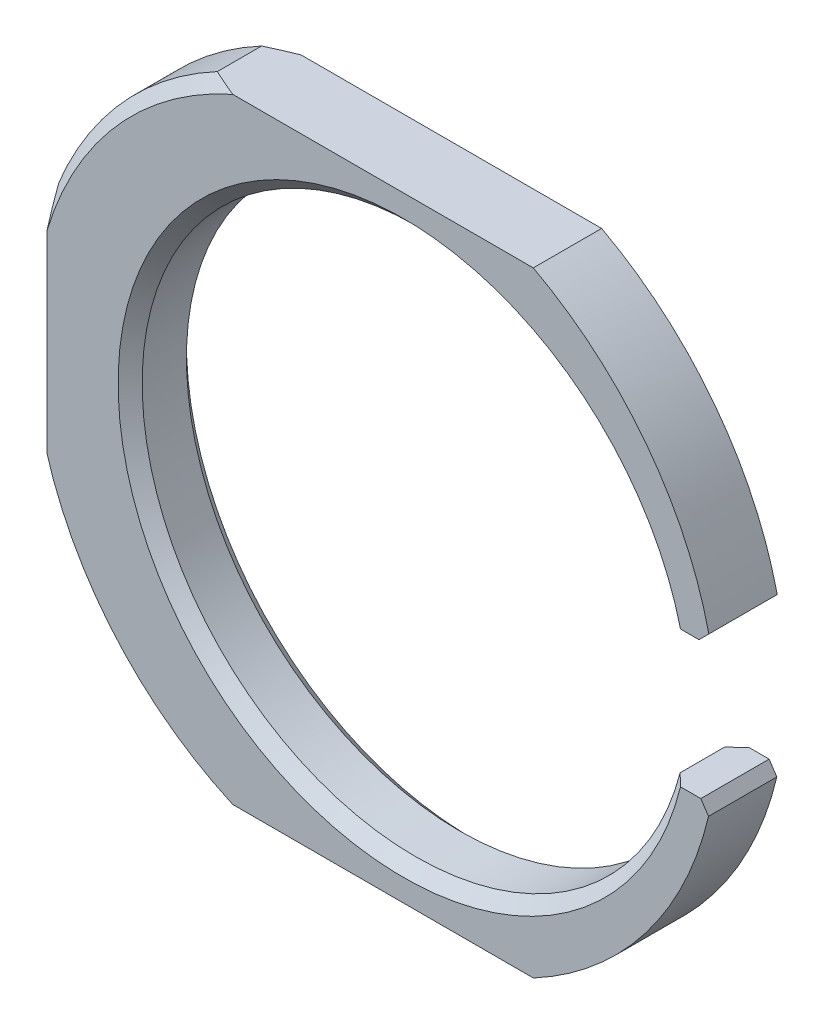
ISO-10303-21;
HEADER;
FILE_DESCRIPTION(('STEP AP214'),'2;1');
FILE_NAME('part.step','',(''),(''),'','','');
FILE_SCHEMA(('AUTOMOTIVE_DESIGN { 1 0 10303 214 1 1 1 1 }'));
ENDSEC;
DATA;
#1=APPLICATION_CONTEXT('core data for automotive mechanical design processes');
#2=APPLICATION_PROTOCOL_DEFINITION('international standard','automotive_design',2000,#1);
#3=PRODUCT_CONTEXT('',#1,'mechanical');
#4=PRODUCT('Part','Part','',(#3));
#5=PRODUCT_RELATED_PRODUCT_CATEGORY('part','',(#4));
#6=PRODUCT_DEFINITION_FORMATION('','',#4);
#7=PRODUCT_DEFINITION_CONTEXT('part definition',#1,'design');
#8=PRODUCT_DEFINITION('design','',#6,#7);
#9=PRODUCT_DEFINITION_SHAPE('','',#8);
#10=(LENGTH_UNIT() NAMED_UNIT(*) SI_UNIT(.MILLI.,.METRE.));
#11=(NAMED_UNIT(*) PLANE_ANGLE_UNIT() SI_UNIT($,.RADIAN.));
#12=(NAMED_UNIT(*) SI_UNIT($,.STERADIAN.) SOLID_ANGLE_UNIT());
#13=UNCERTAINTY_MEASURE_WITH_UNIT(LENGTH_MEASURE(1.E-05),#10,'distance_accuracy_value','');
#14=(GEOMETRIC_REPRESENTATION_CONTEXT(3) GLOBAL_UNCERTAINTY_ASSIGNED_CONTEXT((#13)) GLOBAL_UNIT_ASSIGNED_CONTEXT((#10,
#11,#12)) REPRESENTATION_CONTEXT('',''));
#15=CARTESIAN_POINT('',(0.,0.,0.));
#16=DIRECTION('',(0.,0.,1.));
#17=DIRECTION('',(1.,0.,0.));
#18=AXIS2_PLACEMENT_3D('',#15,#16,#17);
#19=CARTESIAN_POINT('',(7.62,14.2875,3.175));
#20=DIRECTION('',(0.,-1.,0.));
#21=DIRECTION('',(0.,0.,-1.));
#22=AXIS2_PLACEMENT_3D('',#19,#20,#21);
#23=PLANE('',#22);
#24=DIRECTION('',(-1.,0.,0.));
#25=VECTOR('',#24,1.);
#26=CARTESIAN_POINT('',(7.62,14.2875,0.));
#27=LINE('',#26,#25);
#28=CARTESIAN_POINT('',(7.62,14.2875,0.));
#29=VERTEX_POINT('',#28);
#30=CARTESIAN_POINT('',(-6.34664631439312,14.2875,0.));
#31=VERTEX_POINT('',#30);
#32=EDGE_CURVE('E190',#29,#31,#27,.T.);
#33=ORIENTED_EDGE('',*,*,#32,.T.);
#34=CARTESIAN_POINT('',(-6.34664631439313,14.2875,0.));
#35=CARTESIAN_POINT('',(-6.45404104298012,14.2875,0.0435982299034301));
#36=CARTESIAN_POINT('',(-6.56111289626262,14.2875,0.087988948330012));
#37=CARTESIAN_POINT('',(-6.77459834155767,14.2875,0.178272735871204));
#38=CARTESIAN_POINT('',(-6.88101205076103,14.2875,0.224165527796904));
#39=CARTESIAN_POINT('',(-7.09320699370116,14.2875,0.31738640247918));
#40=CARTESIAN_POINT('',(-7.19898823406698,14.2875,0.364714470160571));
#41=CARTESIAN_POINT('',(-7.40994842174969,14.2875,0.460745408772582));
#42=CARTESIAN_POINT('',(-7.51512725495978,14.2875,0.509448530437032));
#43=CARTESIAN_POINT('',(-7.62000000000002,14.2875,0.558799999999944));
#44=B_SPLINE_CURVE_WITH_KNOTS('',3,(#34,#35,#36,#37,#38,#39,#40,#41,#42,#43),.UNSPECIFIED.,.F.,
.F.,(4,2,2,2,4),(0.,0.347716312491453,0.695368816103363,1.04301766946793,1.39073032947845),.UNSPECIFIED.);
#45=CARTESIAN_POINT('',(-7.62,14.2875,0.558800000000005));
#46=VERTEX_POINT('',#45);
#47=EDGE_CURVE('E308',#31,#46,#44,.T.);
#48=ORIENTED_EDGE('',*,*,#47,.T.);
#49=DIRECTION('',(0.,0.,-1.));
#50=VECTOR('',#49,1.);
#51=CARTESIAN_POINT('',(-7.62,14.2875,3.175));
#52=LINE('',#51,#50);
#53=CARTESIAN_POINT('',(-7.62,14.2875,2.61619999999999));
#54=VERTEX_POINT('',#53);
#55=EDGE_CURVE('E222',#54,#46,#52,.T.);
#56=ORIENTED_EDGE('',*,*,#55,.F.);
#57=CARTESIAN_POINT('',(-7.62,14.2875,2.61619999999999));
#58=CARTESIAN_POINT('',(-7.51512725495977,14.2875,2.66555146956294));
#59=CARTESIAN_POINT('',(-7.40994842174969,14.2875,2.71425459122741));
#60=CARTESIAN_POINT('',(-7.19898823406699,14.2875,2.81028552983943));
#61=CARTESIAN_POINT('',(-7.09320699370117,14.2875,2.85761359752082));
#62=CARTESIAN_POINT('',(-6.88101205076104,14.2875,2.95083447220309));
#63=CARTESIAN_POINT('',(-6.77459834155767,14.2875,2.9967272641288));
#64=CARTESIAN_POINT('',(-6.56111289626263,14.2875,3.08701105166999));
#65=CARTESIAN_POINT('',(-6.45404104298013,14.2875,3.13140177009657));
#66=CARTESIAN_POINT('',(-6.34664631439313,14.2875,3.175));
#67=B_SPLINE_CURVE_WITH_KNOTS('',3,(#57,#58,#59,#60,#61,#62,#63,#64,#65,#66),.UNSPECIFIED.,.F.,
.F.,(4,2,2,2,4),(0.,0.347712660010522,0.695361513375088,1.043014016987,1.39073032947845),.UNSPECIFIED.);
#68=CARTESIAN_POINT('',(-6.34664631439313,14.2875,3.175));
#69=VERTEX_POINT('',#68);
#70=EDGE_CURVE('E302',#54,#69,#67,.T.);
#71=ORIENTED_EDGE('',*,*,#70,.T.);
#72=DIRECTION('',(-1.,0.,0.));
#73=VECTOR('',#72,1.);
#74=CARTESIAN_POINT('',(7.62,14.2875,3.175));
#75=LINE('',#74,#73);
#76=CARTESIAN_POINT('',(7.62,14.2875,3.175));
#77=VERTEX_POINT('',#76);
#78=EDGE_CURVE('E207',#77,#69,#75,.T.);
#79=ORIENTED_EDGE('',*,*,#78,.F.);
#80=DIRECTION('',(0.,0.,-1.));
#81=VECTOR('',#80,1.);
#82=CARTESIAN_POINT('',(7.62,14.2875,3.175));
#83=LINE('',#82,#81);
#84=EDGE_CURVE('E189',#77,#29,#83,.T.);
#85=ORIENTED_EDGE('',*,*,#84,.T.);
#86=EDGE_LOOP('',(#33,#48,#56,#71,#79,#85));
#87=FACE_BOUND('',#86,.T.);
#88=ADVANCED_FACE('F33',(#87),#23,.F.);
#89=CARTESIAN_POINT('',(0.,0.,3.175));
#90=DIRECTION('',(0.,0.,-1.));
#91=DIRECTION('',(-1.,0.,0.));
#92=AXIS2_PLACEMENT_3D('',#89,#90,#91);
#93=CYLINDRICAL_SURFACE('',#92,16.1925);
#94=ORIENTED_EDGE('',*,*,#55,.T.);
#95=CARTESIAN_POINT('',(0.,0.,0.558800000000005));
#96=DIRECTION('',(0.,0.,1.));
#97=DIRECTION('',(1.,0.,0.));
#98=AXIS2_PLACEMENT_3D('',#95,#96,#97);
#99=CIRCLE('',#98,16.1925);
#100=CARTESIAN_POINT('',(-14.986,6.13325853441709,0.558800000000005));
#101=VERTEX_POINT('',#100);
#102=EDGE_CURVE('E410',#46,#101,#99,.T.);
#103=ORIENTED_EDGE('',*,*,#102,.T.);
#104=DIRECTION('',(0.,0.,-1.));
#105=VECTOR('',#104,1.);
#106=CARTESIAN_POINT('',(-14.986,6.13325853441709,3.175));
#107=LINE('',#106,#105);
#108=CARTESIAN_POINT('',(-14.986,6.13325853441709,2.61619999999999));
#109=VERTEX_POINT('',#108);
#110=EDGE_CURVE('E219',#109,#101,#107,.T.);
#111=ORIENTED_EDGE('',*,*,#110,.F.);
#112=CARTESIAN_POINT('',(0.,0.,2.61619999999999));
#113=DIRECTION('',(0.,0.,1.));
#114=DIRECTION('',(1.,0.,0.));
#115=AXIS2_PLACEMENT_3D('',#112,#113,#114);
#116=CIRCLE('',#115,16.1925);
#117=EDGE_CURVE('E413',#109,#54,#116,.F.);
#118=ORIENTED_EDGE('',*,*,#117,.T.);
#119=EDGE_LOOP('',(#94,#103,#111,#118));
#120=FACE_BOUND('',#119,.T.);
#121=ADVANCED_FACE('F260',(#120),#93,.T.);
#122=CARTESIAN_POINT('',(-14.986,6.13325853441708,3.175));
#123=DIRECTION('',(1.,0.,0.));
#124=DIRECTION('',(0.,0.,-1.));
#125=AXIS2_PLACEMENT_3D('',#122,#123,#124);
#126=PLANE('',#125);
#127=DIRECTION('',(0.,-1.,0.));
#128=VECTOR('',#127,1.);
#129=CARTESIAN_POINT('',(-14.986,6.13325853441708,0.));
#130=LINE('',#129,#128);
#131=CARTESIAN_POINT('',(-14.986,4.45335600306105,0.));
#132=VERTEX_POINT('',#131);
#133=CARTESIAN_POINT('',(-14.986,-4.45335600306103,0.));
#134=VERTEX_POINT('',#133);
#135=EDGE_CURVE('E193',#132,#134,#130,.T.);
#136=ORIENTED_EDGE('',*,*,#135,.T.);
#137=CARTESIAN_POINT('',(-14.986,-4.45335600306103,0.));
#138=CARTESIAN_POINT('',(-14.986,-4.59532339639313,0.0404398765741876));
#139=CARTESIAN_POINT('',(-14.986,-4.73681905004097,0.0825230687504273));
#140=CARTESIAN_POINT('',(-14.986,-5.01878121089509,0.16979330733088));
#141=CARTESIAN_POINT('',(-14.986,-5.15924814970773,0.214978958425647));
#142=CARTESIAN_POINT('',(-14.986,-5.4391904429487,0.308306542242773));
#143=CARTESIAN_POINT('',(-14.986,-5.57866582336938,0.356448397151095));
#144=CARTESIAN_POINT('',(-14.986,-5.85668176785979,0.455552446877674));
#145=CARTESIAN_POINT('',(-14.986,-5.99522188616804,0.506515892847684));
#146=CARTESIAN_POINT('',(-14.986,-6.13325853441708,0.558800000000006));
#147=B_SPLINE_CURVE_WITH_KNOTS('',3,(#137,#138,#139,#140,#141,#142,#143,#144,#145,#146),
.UNSPECIFIED.,.F.,.F.,(4,2,2,2,4),(0.,0.442829437828835,0.885461004480531,1.32808092504822,
1.77089870930894),.UNSPECIFIED.);
#148=CARTESIAN_POINT('',(-14.986,-6.13325853441708,0.558800000000005));
#149=VERTEX_POINT('',#148);
#150=EDGE_CURVE('E284',#134,#149,#147,.T.);
#151=ORIENTED_EDGE('',*,*,#150,.T.);
#152=DIRECTION('',(0.,0.,-1.));
#153=VECTOR('',#152,1.);
#154=CARTESIAN_POINT('',(-14.986,-6.13325853441708,3.175));
#155=LINE('',#154,#153);
#156=CARTESIAN_POINT('',(-14.986,-6.13325853441708,2.61619999999998));
#157=VERTEX_POINT('',#156);
#158=EDGE_CURVE('E216',#157,#149,#155,.T.);
#159=ORIENTED_EDGE('',*,*,#158,.F.);
#160=CARTESIAN_POINT('',(-14.986,-6.13325853441708,2.61619999999998));
#161=CARTESIAN_POINT('',(-14.986,-5.99522188616804,2.6684841071523));
#162=CARTESIAN_POINT('',(-14.986,-5.85668176785979,2.71944755312232));
#163=CARTESIAN_POINT('',(-14.986,-5.57866582336937,2.8185516028489));
#164=CARTESIAN_POINT('',(-14.986,-5.43919044294869,2.86669345775722));
#165=CARTESIAN_POINT('',(-14.986,-5.15924814970771,2.96002104157435));
#166=CARTESIAN_POINT('',(-14.986,-5.01878121089507,3.00520669266911));
#167=CARTESIAN_POINT('',(-14.986,-4.73681905004096,3.09247693124957));
#168=CARTESIAN_POINT('',(-14.986,-4.59532339639311,3.13456012342581));
#169=CARTESIAN_POINT('',(-14.986,-4.45335600306101,3.175));
#170=B_SPLINE_CURVE_WITH_KNOTS('',3,(#160,#161,#162,#163,#164,#165,#166,#167,#168,#169),
.UNSPECIFIED.,.F.,.F.,(4,2,2,2,4),(0.,0.442817784260725,0.885437704828423,1.32806927148013,
1.77089870930897),.UNSPECIFIED.);
#171=CARTESIAN_POINT('',(-14.986,-4.453356003061,3.175));
#172=VERTEX_POINT('',#171);
#173=EDGE_CURVE('E280',#157,#172,#170,.T.);
#174=ORIENTED_EDGE('',*,*,#173,.T.);
#175=DIRECTION('',(0.,-1.,0.));
#176=VECTOR('',#175,1.);
#177=CARTESIAN_POINT('',(-14.986,6.13325853441708,3.175));
#178=LINE('',#177,#176);
#179=CARTESIAN_POINT('',(-14.986,4.45335600306105,3.175));
#180=VERTEX_POINT('',#179);
#181=EDGE_CURVE('E167',#180,#172,#178,.T.);
#182=ORIENTED_EDGE('',*,*,#181,.F.);
#183=CARTESIAN_POINT('',(-14.986,4.45335600306105,3.175));
#184=CARTESIAN_POINT('',(-14.986,4.59532339639316,3.13456012342581));
#185=CARTESIAN_POINT('',(-14.986,4.73681905004099,3.09247693124957));
#186=CARTESIAN_POINT('',(-14.986,5.0187812108951,3.00520669266912));
#187=CARTESIAN_POINT('',(-14.986,5.15924814970774,2.96002104157435));
#188=CARTESIAN_POINT('',(-14.986,5.43919044294871,2.86669345775722));
#189=CARTESIAN_POINT('',(-14.986,5.57866582336939,2.8185516028489));
#190=CARTESIAN_POINT('',(-14.986,5.8566817678598,2.71944755312232));
#191=CARTESIAN_POINT('',(-14.986,5.99522188616805,2.66848410715231));
#192=CARTESIAN_POINT('',(-14.986,6.13325853441709,2.61619999999999));
#193=B_SPLINE_CURVE_WITH_KNOTS('',3,(#183,#184,#185,#186,#187,#188,#189,#190,#191,#192),
.UNSPECIFIED.,.F.,.F.,(4,2,2,2,4),(0.,0.442829437828829,0.88546100448052,1.32808092504821,
1.77089870930892),.UNSPECIFIED.);
#194=EDGE_CURVE('E266',#180,#109,#193,.T.);
#195=ORIENTED_EDGE('',*,*,#194,.T.);
#196=ORIENTED_EDGE('',*,*,#110,.T.);
#197=CARTESIAN_POINT('',(-14.986,6.13325853441709,0.558800000000005));
#198=CARTESIAN_POINT('',(-14.986,5.99522188616805,0.506515892847682));
#199=CARTESIAN_POINT('',(-14.986,5.8566817678598,0.455552446877673));
#200=CARTESIAN_POINT('',(-14.986,5.57866582336939,0.356448397151096));
#201=CARTESIAN_POINT('',(-14.986,5.4391904429487,0.308306542242776));
#202=CARTESIAN_POINT('',(-14.986,5.15924814970773,0.21497895842565));
#203=CARTESIAN_POINT('',(-14.986,5.0187812108951,0.169793307330881));
#204=CARTESIAN_POINT('',(-14.986,4.73681905004099,0.0825230687504263));
#205=CARTESIAN_POINT('',(-14.986,4.59532339639315,0.0404398765741859));
#206=CARTESIAN_POINT('',(-14.986,4.45335600306104,0.));
#207=B_SPLINE_CURVE_WITH_KNOTS('',3,(#197,#198,#199,#200,#201,#202,#203,#204,#205,#206),
.UNSPECIFIED.,.F.,.F.,(4,2,2,2,4),(0.,0.442817784260716,0.885437704828405,1.3280692714801,
1.77089870930893),.UNSPECIFIED.);
#208=EDGE_CURVE('E275',#101,#132,#207,.T.);
#209=ORIENTED_EDGE('',*,*,#208,.T.);
#210=EDGE_LOOP('',(#136,#151,#159,#174,#182,#195,#196,#209));
#211=FACE_BOUND('',#210,.T.);
#212=ADVANCED_FACE('F255',(#211),#126,.F.);
#213=CARTESIAN_POINT('',(0.,0.,3.175));
#214=DIRECTION('',(0.,0.,-1.));
#215=DIRECTION('',(-1.,0.,0.));
#216=AXIS2_PLACEMENT_3D('',#213,#214,#215);
#217=CYLINDRICAL_SURFACE('',#216,16.1925);
#218=ORIENTED_EDGE('',*,*,#158,.T.);
#219=CARTESIAN_POINT('',(0.,0.,0.558800000000005));
#220=DIRECTION('',(0.,0.,1.));
#221=DIRECTION('',(1.,0.,0.));
#222=AXIS2_PLACEMENT_3D('',#219,#220,#221);
#223=CIRCLE('',#222,16.1925);
#224=CARTESIAN_POINT('',(-7.62,-14.2875,0.558800000000005));
#225=VERTEX_POINT('',#224);
#226=EDGE_CURVE('E227',#149,#225,#223,.T.);
#227=ORIENTED_EDGE('',*,*,#226,.T.);
#228=DIRECTION('',(0.,0.,-1.));
#229=VECTOR('',#228,1.);
#230=CARTESIAN_POINT('',(-7.62,-14.2875,3.175));
#231=LINE('',#230,#229);
#232=CARTESIAN_POINT('',(-7.62,-14.2875,2.61619999999998));
#233=VERTEX_POINT('',#232);
#234=EDGE_CURVE('E176',#233,#225,#231,.T.);
#235=ORIENTED_EDGE('',*,*,#234,.F.);
#236=CARTESIAN_POINT('',(0.,0.,2.61619999999998));
#237=DIRECTION('',(0.,0.,1.));
#238=DIRECTION('',(1.,0.,0.));
#239=AXIS2_PLACEMENT_3D('',#236,#237,#238);
#240=CIRCLE('',#239,16.1925);
#241=EDGE_CURVE('E225',#233,#157,#240,.F.);
#242=ORIENTED_EDGE('',*,*,#241,.T.);
#243=EDGE_LOOP('',(#218,#227,#235,#242));
#244=FACE_BOUND('',#243,.T.);
#245=ADVANCED_FACE('F250',(#244),#217,.T.);
#246=CARTESIAN_POINT('',(-7.61999999999999,-14.2875,3.175));
#247=DIRECTION('',(0.,1.,0.));
#248=DIRECTION('',(0.,0.,1.));
#249=AXIS2_PLACEMENT_3D('',#246,#247,#248);
#250=PLANE('',#249);
#251=ORIENTED_EDGE('',*,*,#234,.T.);
#252=CARTESIAN_POINT('',(-7.62,-14.2875,0.558800000000005));
#253=CARTESIAN_POINT('',(-7.51512725495977,-14.2875,0.509448530437058));
#254=CARTESIAN_POINT('',(-7.40994842174969,-14.2875,0.460745408772591));
#255=CARTESIAN_POINT('',(-7.19898823406699,-14.2875,0.364714470160568));
#256=CARTESIAN_POINT('',(-7.09320699370116,-14.2875,0.317386402479179));
#257=CARTESIAN_POINT('',(-6.88101205076103,-14.2875,0.224165527796905));
#258=CARTESIAN_POINT('',(-6.77459834155766,-14.2875,0.178272735871204));
#259=CARTESIAN_POINT('',(-6.56111289626261,-14.2875,0.0879889483300097));
#260=CARTESIAN_POINT('',(-6.4540410429801,-14.2875,0.0435982299034266));
#261=CARTESIAN_POINT('',(-6.34664631439311,-14.2875,0.));
#262=B_SPLINE_CURVE_WITH_KNOTS('',3,(#252,#253,#254,#255,#256,#257,#258,#259,#260,#261),
.UNSPECIFIED.,.F.,.F.,(4,2,2,2,4),(0.,0.347712660010527,0.6953615133751,1.04301401698702,
1.39073032947848),.UNSPECIFIED.);
#263=CARTESIAN_POINT('',(-6.34664631439311,-14.2875,0.));
#264=VERTEX_POINT('',#263);
#265=EDGE_CURVE('E237',#225,#264,#262,.T.);
#266=ORIENTED_EDGE('',*,*,#265,.T.);
#267=DIRECTION('',(1.,0.,0.));
#268=VECTOR('',#267,1.);
#269=CARTESIAN_POINT('',(-7.61999999999999,-14.2875,0.));
#270=LINE('',#269,#268);
#271=CARTESIAN_POINT('',(7.61999999999999,-14.2875,0.));
#272=VERTEX_POINT('',#271);
#273=EDGE_CURVE('E174',#264,#272,#270,.T.);
#274=ORIENTED_EDGE('',*,*,#273,.T.);
#275=DIRECTION('',(0.,0.,-1.));
#276=VECTOR('',#275,1.);
#277=CARTESIAN_POINT('',(7.61999999999999,-14.2875,3.175));
#278=LINE('',#277,#276);
#279=CARTESIAN_POINT('',(7.61999999999999,-14.2875,3.175));
#280=VERTEX_POINT('',#279);
#281=EDGE_CURVE('E170',#280,#272,#278,.T.);
#282=ORIENTED_EDGE('',*,*,#281,.F.);
#283=DIRECTION('',(1.,0.,0.));
#284=VECTOR('',#283,1.);
#285=CARTESIAN_POINT('',(-7.61999999999999,-14.2875,3.175));
#286=LINE('',#285,#284);
#287=CARTESIAN_POINT('',(-6.34664631439309,-14.2875,3.175));
#288=VERTEX_POINT('',#287);
#289=EDGE_CURVE('E158',#288,#280,#286,.T.);
#290=ORIENTED_EDGE('',*,*,#289,.F.);
#291=CARTESIAN_POINT('',(-6.34664631439309,-14.2875,3.175));
#292=CARTESIAN_POINT('',(-6.45404104298009,-14.2875,3.13140177009657));
#293=CARTESIAN_POINT('',(-6.56111289626259,-14.2875,3.08701105166998));
#294=CARTESIAN_POINT('',(-6.77459834155764,-14.2875,2.99672726412879));
#295=CARTESIAN_POINT('',(-6.88101205076102,-14.2875,2.95083447220309));
#296=CARTESIAN_POINT('',(-7.09320699370114,-14.2875,2.85761359752081));
#297=CARTESIAN_POINT('',(-7.19898823406697,-14.2875,2.81028552983942));
#298=CARTESIAN_POINT('',(-7.40994842174968,-14.2875,2.7142545912274));
#299=CARTESIAN_POINT('',(-7.51512725495978,-14.2875,2.66555146956295));
#300=CARTESIAN_POINT('',(-7.62000000000003,-14.2875,2.61620000000004));
#301=B_SPLINE_CURVE_WITH_KNOTS('',3,(#291,#292,#293,#294,#295,#296,#297,#298,#299,#300),
.UNSPECIFIED.,.F.,.F.,(4,2,2,2,4),(0.,0.347716312491463,0.695368816103383,1.04301766946796,
1.39073032947849),.UNSPECIFIED.);
#302=EDGE_CURVE('E230',#288,#233,#301,.T.);
#303=ORIENTED_EDGE('',*,*,#302,.T.);
#304=EDGE_LOOP('',(#251,#266,#274,#282,#290,#303));
#305=FACE_BOUND('',#304,.T.);
#306=ADVANCED_FACE('F172',(#305),#250,.F.);
#307=CARTESIAN_POINT('',(0.,0.,3.175));
#308=DIRECTION('',(0.,0.,-1.));
#309=DIRECTION('',(-1.,0.,0.));
#310=AXIS2_PLACEMENT_3D('',#307,#308,#309);
#311=CYLINDRICAL_SURFACE('',#310,16.1925);
#312=CARTESIAN_POINT('',(0.,0.,0.));
#313=DIRECTION('',(0.,0.,1.));
#314=DIRECTION('',(1.,0.,0.));
#315=AXIS2_PLACEMENT_3D('',#312,#313,#314);
#316=CIRCLE('',#315,16.1925);
#317=CARTESIAN_POINT('',(15.7612900417545,-3.7119795890724,0.));
#318=VERTEX_POINT('',#317);
#319=EDGE_CURVE('E197',#272,#318,#316,.T.);
#320=ORIENTED_EDGE('',*,*,#319,.T.);
#321=DIRECTION('',(0.,0.,-1.));
#322=VECTOR('',#321,1.);
#323=CARTESIAN_POINT('',(15.7612900417545,-3.7119795890724,3.175));
#324=LINE('',#323,#322);
#325=CARTESIAN_POINT('',(15.7612900417545,-3.7119795890724,3.175));
#326=VERTEX_POINT('',#325);
#327=EDGE_CURVE('E11',#318,#326,#324,.F.);
#328=ORIENTED_EDGE('',*,*,#327,.T.);
#329=CARTESIAN_POINT('',(0.,0.,3.175));
#330=DIRECTION('',(0.,0.,1.));
#331=DIRECTION('',(1.,0.,0.));
#332=AXIS2_PLACEMENT_3D('',#329,#330,#331);
#333=CIRCLE('',#332,16.1925);
#334=EDGE_CURVE('E162',#280,#326,#333,.T.);
#335=ORIENTED_EDGE('',*,*,#334,.F.);
#336=ORIENTED_EDGE('',*,*,#281,.T.);
#337=EDGE_LOOP('',(#320,#328,#335,#336));
#338=FACE_BOUND('',#337,.T.);
#339=ADVANCED_FACE('F179',(#338),#311,.T.);
#340=CARTESIAN_POINT('',(13.8842221242085,-3.175,3.175));
#341=DIRECTION('',(0.,1.,0.));
#342=DIRECTION('',(-1.,0.,0.));
#343=AXIS2_PLACEMENT_3D('',#340,#341,#342);
#344=PLANE('',#343);
#345=DIRECTION('',(1.,0.,0.));
#346=VECTOR('',#345,1.);
#347=CARTESIAN_POINT('',(13.8842221242085,-3.175,3.175));
#348=LINE('',#347,#346);
#349=CARTESIAN_POINT('',(14.4605397513563,-3.175,3.175));
#350=VERTEX_POINT('',#349);
#351=CARTESIAN_POINT('',(15.403273824793,-3.175,3.175));
#352=VERTEX_POINT('',#351);
#353=EDGE_CURVE('E180',#350,#352,#348,.T.);
#354=ORIENTED_EDGE('',*,*,#353,.T.);
#355=DIRECTION('',(0.,0.,-1.));
#356=VECTOR('',#355,1.);
#357=CARTESIAN_POINT('',(15.403273824793,-3.175,0.));
#358=LINE('',#357,#356);
#359=CARTESIAN_POINT('',(15.403273824793,-3.175,0.));
#360=VERTEX_POINT('',#359);
#361=EDGE_CURVE('E41',#352,#360,#358,.T.);
#362=ORIENTED_EDGE('',*,*,#361,.T.);
#363=DIRECTION('',(1.,0.,0.));
#364=VECTOR('',#363,1.);
#365=CARTESIAN_POINT('',(13.8842221242085,-3.175,0.));
#366=LINE('',#365,#364);
#367=CARTESIAN_POINT('',(14.4605397513563,-3.175,0.));
#368=VERTEX_POINT('',#367);
#369=EDGE_CURVE('E199',#368,#360,#366,.T.);
#370=ORIENTED_EDGE('',*,*,#369,.F.);
#371=CARTESIAN_POINT('',(14.4605397513563,-3.175,0.));
#372=CARTESIAN_POINT('',(14.3645506170969,-3.175,0.0931991366032787));
#373=CARTESIAN_POINT('',(14.2685295811596,-3.175,0.186365371454051));
#374=CARTESIAN_POINT('',(14.076423705444,-3.175,0.37263203812105));
#375=CARTESIAN_POINT('',(13.9803388656654,-3.175,0.465732469936945));
#376=CARTESIAN_POINT('',(13.8842221242085,-3.175,0.558800000000001));
#377=B_SPLINE_CURVE_WITH_KNOTS('',3,(#371,#372,#373,#374,#375,#376),.UNSPECIFIED.,.F.,.F.,(4,2,
4),(0.,0.401372495231906,0.802744992491367),.UNSPECIFIED.);
#378=CARTESIAN_POINT('',(13.8842221242085,-3.175,0.558800000000002));
#379=VERTEX_POINT('',#378);
#380=EDGE_CURVE('E337',#368,#379,#377,.T.);
#381=ORIENTED_EDGE('',*,*,#380,.T.);
#382=DIRECTION('',(0.,0.,-1.));
#383=VECTOR('',#382,1.);
#384=CARTESIAN_POINT('',(13.8842221242085,-3.175,3.175));
#385=LINE('',#384,#383);
#386=CARTESIAN_POINT('',(13.8842221242085,-3.175,2.61619999999999));
#387=VERTEX_POINT('',#386);
#388=EDGE_CURVE('E177',#387,#379,#385,.T.);
#389=ORIENTED_EDGE('',*,*,#388,.F.);
#390=CARTESIAN_POINT('',(13.8842221242085,-3.175,2.61619999999999));
#391=CARTESIAN_POINT('',(13.9803388656654,-3.175,2.70926753006305));
#392=CARTESIAN_POINT('',(14.076423705444,-3.175,2.80236796187894));
#393=CARTESIAN_POINT('',(14.2685295811596,-3.175,2.98863462854595));
#394=CARTESIAN_POINT('',(14.3645506170969,-3.175,3.08180086339672));
#395=CARTESIAN_POINT('',(14.4605397513563,-3.175,3.175));
#396=B_SPLINE_CURVE_WITH_KNOTS('',3,(#390,#391,#392,#393,#394,#395),.UNSPECIFIED.,.F.,.F.,(4,2,
4),(0.,0.401372497259468,0.802744992491381),.UNSPECIFIED.);
#397=EDGE_CURVE('E313',#387,#350,#396,.T.);
#398=ORIENTED_EDGE('',*,*,#397,.T.);
#399=EDGE_LOOP('',(#354,#362,#370,#381,#389,#398));
#400=FACE_BOUND('',#399,.T.);
#401=ADVANCED_FACE('F368',(#400),#344,.T.);
#402=CARTESIAN_POINT('',(1.5875,0.,3.175));
#403=DIRECTION('',(0.,0.,-1.));
#404=DIRECTION('',(-1.,0.,0.));
#405=AXIS2_PLACEMENT_3D('',#402,#403,#404);
#406=CYLINDRICAL_SURFACE('',#405,12.7);
#407=ORIENTED_EDGE('',*,*,#388,.T.);
#408=CARTESIAN_POINT('',(1.5875,0.,0.558800000000002));
#409=DIRECTION('',(0.,0.,1.));
#410=DIRECTION('',(1.,0.,0.));
#411=AXIS2_PLACEMENT_3D('',#408,#409,#410);
#412=CIRCLE('',#411,12.7);
#413=CARTESIAN_POINT('',(13.8842221242085,3.175,0.558800000000002));
#414=VERTEX_POINT('',#413);
#415=EDGE_CURVE('E429',#379,#414,#412,.F.);
#416=ORIENTED_EDGE('',*,*,#415,.T.);
#417=DIRECTION('',(0.,0.,-1.));
#418=VECTOR('',#417,1.);
#419=CARTESIAN_POINT('',(13.8842221242085,3.175,3.175));
#420=LINE('',#419,#418);
#421=CARTESIAN_POINT('',(13.8842221242085,3.175,2.61619999999999));
#422=VERTEX_POINT('',#421);
#423=EDGE_CURVE('E210',#422,#414,#420,.T.);
#424=ORIENTED_EDGE('',*,*,#423,.F.);
#425=CARTESIAN_POINT('',(1.5875,0.,2.61619999999999));
#426=DIRECTION('',(0.,0.,1.));
#427=DIRECTION('',(1.,0.,0.));
#428=AXIS2_PLACEMENT_3D('',#425,#426,#427);
#429=CIRCLE('',#428,12.7);
#430=EDGE_CURVE('E428',#422,#387,#429,.T.);
#431=ORIENTED_EDGE('',*,*,#430,.T.);
#432=EDGE_LOOP('',(#407,#416,#424,#431));
#433=FACE_BOUND('',#432,.T.);
#434=ADVANCED_FACE('F363',(#433),#406,.F.);
#435=CARTESIAN_POINT('',(13.8842221242085,3.175,3.175));
#436=DIRECTION('',(0.,1.,0.));
#437=DIRECTION('',(-1.,0.,0.));
#438=AXIS2_PLACEMENT_3D('',#435,#436,#437);
#439=PLANE('',#438);
#440=DIRECTION('',(1.,0.,0.));
#441=VECTOR('',#440,1.);
#442=CARTESIAN_POINT('',(13.8842221242085,3.175,0.));
#443=LINE('',#442,#441);
#444=CARTESIAN_POINT('',(14.4605397513563,3.175,0.));
#445=VERTEX_POINT('',#444);
#446=CARTESIAN_POINT('',(15.3193746825635,3.175,0.));
#447=VERTEX_POINT('',#446);
#448=EDGE_CURVE('E202',#445,#447,#443,.T.);
#449=ORIENTED_EDGE('',*,*,#448,.T.);
#450=DIRECTION('',(0.,0.,1.));
#451=VECTOR('',#450,1.);
#452=CARTESIAN_POINT('',(15.3193746825635,3.175,3.175));
#453=LINE('',#452,#451);
#454=CARTESIAN_POINT('',(15.3193746825635,3.175,3.175));
#455=VERTEX_POINT('',#454);
#456=EDGE_CURVE('E388',#447,#455,#453,.T.);
#457=ORIENTED_EDGE('',*,*,#456,.T.);
#458=DIRECTION('',(1.,0.,0.));
#459=VECTOR('',#458,1.);
#460=CARTESIAN_POINT('',(13.8842221242085,3.175,3.175));
#461=LINE('',#460,#459);
#462=CARTESIAN_POINT('',(14.4605397513563,3.175,3.175));
#463=VERTEX_POINT('',#462);
#464=EDGE_CURVE('E182',#463,#455,#461,.T.);
#465=ORIENTED_EDGE('',*,*,#464,.F.);
#466=CARTESIAN_POINT('',(14.4605397513563,3.175,3.175));
#467=CARTESIAN_POINT('',(14.3645506170969,3.175,3.08180086339672));
#468=CARTESIAN_POINT('',(14.2685295811596,3.175,2.98863462854595));
#469=CARTESIAN_POINT('',(14.076423705444,3.175,2.80236796187894));
#470=CARTESIAN_POINT('',(13.9803388656654,3.175,2.70926753006305));
#471=CARTESIAN_POINT('',(13.8842221242085,3.175,2.61619999999999));
#472=B_SPLINE_CURVE_WITH_KNOTS('',3,(#466,#467,#468,#469,#470,#471),.UNSPECIFIED.,.F.,.F.,(4,2,
4),(0.,0.401372495231914,0.802744992491381),.UNSPECIFIED.);
#473=EDGE_CURVE('E351',#463,#422,#472,.T.);
#474=ORIENTED_EDGE('',*,*,#473,.T.);
#475=ORIENTED_EDGE('',*,*,#423,.T.);
#476=CARTESIAN_POINT('',(13.8842221242085,3.175,0.558800000000002));
#477=CARTESIAN_POINT('',(13.9803388656654,3.175,0.465732469936946));
#478=CARTESIAN_POINT('',(14.076423705444,3.175,0.372632038121051));
#479=CARTESIAN_POINT('',(14.2685295811596,3.175,0.186365371454051));
#480=CARTESIAN_POINT('',(14.3645506170969,3.175,0.0931991366032783));
#481=CARTESIAN_POINT('',(14.4605397513563,3.175,0.));
#482=B_SPLINE_CURVE_WITH_KNOTS('',3,(#476,#477,#478,#479,#480,#481),.UNSPECIFIED.,.F.,.F.,(4,2,
4),(0.,0.401372497259459,0.802744992491367),.UNSPECIFIED.);
#483=EDGE_CURVE('E343',#414,#445,#482,.T.);
#484=ORIENTED_EDGE('',*,*,#483,.T.);
#485=EDGE_LOOP('',(#449,#457,#465,#474,#475,#484));
#486=FACE_BOUND('',#485,.T.);
#487=ADVANCED_FACE('F357',(#486),#439,.F.);
#488=CARTESIAN_POINT('',(0.,0.,3.175));
#489=DIRECTION('',(0.,0.,-1.));
#490=DIRECTION('',(-1.,0.,0.));
#491=AXIS2_PLACEMENT_3D('',#488,#489,#490);
#492=CYLINDRICAL_SURFACE('',#491,16.1925);
#493=CARTESIAN_POINT('',(0.,0.,3.175));
#494=DIRECTION('',(0.,0.,1.));
#495=DIRECTION('',(1.,0.,0.));
#496=AXIS2_PLACEMENT_3D('',#493,#494,#495);
#497=CIRCLE('',#496,16.1925);
#498=CARTESIAN_POINT('',(15.779250183222,3.63487550065854,3.175));
#499=VERTEX_POINT('',#498);
#500=EDGE_CURVE('E187',#499,#77,#497,.T.);
#501=ORIENTED_EDGE('',*,*,#500,.F.);
#502=DIRECTION('',(0.,0.,-1.));
#503=VECTOR('',#502,1.);
#504=CARTESIAN_POINT('',(15.779250183222,3.63487550065854,3.175));
#505=LINE('',#504,#503);
#506=CARTESIAN_POINT('',(15.779250183222,3.63487550065854,0.));
#507=VERTEX_POINT('',#506);
#508=EDGE_CURVE('E350',#499,#507,#505,.T.);
#509=ORIENTED_EDGE('',*,*,#508,.T.);
#510=CARTESIAN_POINT('',(0.,0.,0.));
#511=DIRECTION('',(0.,0.,1.));
#512=DIRECTION('',(1.,0.,0.));
#513=AXIS2_PLACEMENT_3D('',#510,#511,#512);
#514=CIRCLE('',#513,16.1925);
#515=EDGE_CURVE('E205',#507,#29,#514,.T.);
#516=ORIENTED_EDGE('',*,*,#515,.T.);
#517=ORIENTED_EDGE('',*,*,#84,.F.);
#518=EDGE_LOOP('',(#501,#509,#516,#517));
#519=FACE_BOUND('',#518,.T.);
#520=ADVANCED_FACE('F362',(#519),#492,.T.);
#521=CARTESIAN_POINT('',(0.,0.,3.175));
#522=DIRECTION('',(0.,0.,1.));
#523=DIRECTION('',(1.,0.,0.));
#524=AXIS2_PLACEMENT_3D('',#521,#522,#523);
#525=PLANE('',#524);
#526=ORIENTED_EDGE('',*,*,#464,.T.);
#527=DIRECTION('',(-0.70710678118655,-0.707106781186545,0.));
#528=VECTOR('',#527,1.);
#529=CARTESIAN_POINT('',(6.07218734128168,-6.07218734128173,3.175));
#530=LINE('',#529,#528);
#531=EDGE_CURVE('E384',#455,#499,#530,.F.);
#532=ORIENTED_EDGE('',*,*,#531,.T.);
#533=ORIENTED_EDGE('',*,*,#500,.T.);
#534=ORIENTED_EDGE('',*,*,#78,.T.);
#535=CARTESIAN_POINT('',(0.,0.,3.175));
#536=DIRECTION('',(0.,0.,1.));
#537=DIRECTION('',(1.,0.,0.));
#538=AXIS2_PLACEMENT_3D('',#535,#536,#537);
#539=CIRCLE('',#538,15.6337);
#540=EDGE_CURVE('E416',#69,#180,#539,.T.);
#541=ORIENTED_EDGE('',*,*,#540,.T.);
#542=ORIENTED_EDGE('',*,*,#181,.T.);
#543=CARTESIAN_POINT('',(0.,0.,3.175));
#544=DIRECTION('',(0.,0.,1.));
#545=DIRECTION('',(1.,0.,0.));
#546=AXIS2_PLACEMENT_3D('',#543,#544,#545);
#547=CIRCLE('',#546,15.6337);
#548=EDGE_CURVE('E165',#172,#288,#547,.T.);
#549=ORIENTED_EDGE('',*,*,#548,.T.);
#550=ORIENTED_EDGE('',*,*,#289,.T.);
#551=ORIENTED_EDGE('',*,*,#334,.T.);
#552=DIRECTION('',(0.554732188398203,-0.832028965334105,0.));
#553=VECTOR('',#552,1.);
#554=CARTESIAN_POINT('',(9.19782668009242,6.13239530754339,3.175));
#555=LINE('',#554,#553);
#556=EDGE_CURVE('E48',#326,#352,#555,.F.);
#557=ORIENTED_EDGE('',*,*,#556,.T.);
#558=ORIENTED_EDGE('',*,*,#353,.F.);
#559=CARTESIAN_POINT('',(1.5875,0.,3.175));
#560=DIRECTION('',(0.,0.,1.));
#561=DIRECTION('',(1.,0.,0.));
#562=AXIS2_PLACEMENT_3D('',#559,#560,#561);
#563=CIRCLE('',#562,13.2588);
#564=EDGE_CURVE('E289',#350,#463,#563,.F.);
#565=ORIENTED_EDGE('',*,*,#564,.T.);
#566=EDGE_LOOP('',(#526,#532,#533,#534,#541,#542,#549,#550,#551,#557,#558,#565));
#567=FACE_BOUND('',#566,.T.);
#568=ADVANCED_FACE('F161',(#567),#525,.T.);
#569=CARTESIAN_POINT('',(0.,0.,0.));
#570=DIRECTION('',(0.,0.,1.));
#571=DIRECTION('',(1.,0.,0.));
#572=AXIS2_PLACEMENT_3D('',#569,#570,#571);
#573=PLANE('',#572);
#574=ORIENTED_EDGE('',*,*,#515,.F.);
#575=DIRECTION('',(0.70710678118655,0.707106781186545,0.));
#576=VECTOR('',#575,1.);
#577=CARTESIAN_POINT('',(15.779250183222,3.63487550065855,0.));
#578=LINE('',#577,#576);
#579=EDGE_CURVE('E390',#507,#447,#578,.F.);
#580=ORIENTED_EDGE('',*,*,#579,.T.);
#581=ORIENTED_EDGE('',*,*,#448,.F.);
#582=CARTESIAN_POINT('',(1.5875,0.,0.));
#583=DIRECTION('',(0.,0.,1.));
#584=DIRECTION('',(1.,0.,0.));
#585=AXIS2_PLACEMENT_3D('',#582,#583,#584);
#586=CIRCLE('',#585,13.2588);
#587=EDGE_CURVE('E434',#445,#368,#586,.T.);
#588=ORIENTED_EDGE('',*,*,#587,.T.);
#589=ORIENTED_EDGE('',*,*,#369,.T.);
#590=DIRECTION('',(-0.554732188398203,0.832028965334105,0.));
#591=VECTOR('',#590,1.);
#592=CARTESIAN_POINT('',(15.403273824793,-3.175,0.));
#593=LINE('',#592,#591);
#594=EDGE_CURVE('E383',#360,#318,#593,.F.);
#595=ORIENTED_EDGE('',*,*,#594,.T.);
#596=ORIENTED_EDGE('',*,*,#319,.F.);
#597=ORIENTED_EDGE('',*,*,#273,.F.);
#598=CARTESIAN_POINT('',(0.,0.,0.));
#599=DIRECTION('',(0.,0.,1.));
#600=DIRECTION('',(1.,0.,0.));
#601=AXIS2_PLACEMENT_3D('',#598,#599,#600);
#602=CIRCLE('',#601,15.6337);
#603=EDGE_CURVE('E435',#264,#134,#602,.F.);
#604=ORIENTED_EDGE('',*,*,#603,.T.);
#605=ORIENTED_EDGE('',*,*,#135,.F.);
#606=CARTESIAN_POINT('',(0.,0.,0.));
#607=DIRECTION('',(0.,0.,1.));
#608=DIRECTION('',(1.,0.,0.));
#609=AXIS2_PLACEMENT_3D('',#606,#607,#608);
#610=CIRCLE('',#609,15.6337);
#611=EDGE_CURVE('E404',#132,#31,#610,.F.);
#612=ORIENTED_EDGE('',*,*,#611,.T.);
#613=ORIENTED_EDGE('',*,*,#32,.F.);
#614=EDGE_LOOP('',(#574,#580,#581,#588,#589,#595,#596,#597,#604,#605,#612,#613));
#615=FACE_BOUND('',#614,.T.);
#616=ADVANCED_FACE('F294',(#615),#573,.F.);
#617=CARTESIAN_POINT('',(0.,0.,0.558800000000005));
#618=DIRECTION('',(0.,0.,1.));
#619=DIRECTION('',(1.,0.,0.));
#620=AXIS2_PLACEMENT_3D('',#617,#618,#619);
#621=CONICAL_SURFACE('',#620,16.1925,0.785398163397448);
#622=ORIENTED_EDGE('',*,*,#150,.F.);
#623=ORIENTED_EDGE('',*,*,#603,.F.);
#624=ORIENTED_EDGE('',*,*,#265,.F.);
#625=ORIENTED_EDGE('',*,*,#226,.F.);
#626=EDGE_LOOP('',(#622,#623,#624,#625));
#627=FACE_BOUND('',#626,.T.);
#628=ADVANCED_FACE('F291',(#627),#621,.T.);
#629=CARTESIAN_POINT('',(0.,0.,3.175));
#630=DIRECTION('',(0.,0.,-1.));
#631=DIRECTION('',(-1.,0.,0.));
#632=AXIS2_PLACEMENT_3D('',#629,#630,#631);
#633=CONICAL_SURFACE('',#632,15.6337,0.785398163397445);
#634=ORIENTED_EDGE('',*,*,#173,.F.);
#635=ORIENTED_EDGE('',*,*,#241,.F.);
#636=ORIENTED_EDGE('',*,*,#302,.F.);
#637=ORIENTED_EDGE('',*,*,#548,.F.);
#638=EDGE_LOOP('',(#634,#635,#636,#637));
#639=FACE_BOUND('',#638,.T.);
#640=ADVANCED_FACE('F243',(#639),#633,.T.);
#641=CARTESIAN_POINT('',(0.,0.,0.558800000000005));
#642=DIRECTION('',(0.,0.,1.));
#643=DIRECTION('',(1.,0.,0.));
#644=AXIS2_PLACEMENT_3D('',#641,#642,#643);
#645=CONICAL_SURFACE('',#644,16.1925,0.785398163397448);
#646=ORIENTED_EDGE('',*,*,#47,.F.);
#647=ORIENTED_EDGE('',*,*,#611,.F.);
#648=ORIENTED_EDGE('',*,*,#208,.F.);
#649=ORIENTED_EDGE('',*,*,#102,.F.);
#650=EDGE_LOOP('',(#646,#647,#648,#649));
#651=FACE_BOUND('',#650,.T.);
#652=ADVANCED_FACE('F319',(#651),#645,.T.);
#653=CARTESIAN_POINT('',(0.,0.,3.175));
#654=DIRECTION('',(0.,0.,-1.));
#655=DIRECTION('',(-1.,0.,0.));
#656=AXIS2_PLACEMENT_3D('',#653,#654,#655);
#657=CONICAL_SURFACE('',#656,15.6337,0.785398163397442);
#658=ORIENTED_EDGE('',*,*,#70,.F.);
#659=ORIENTED_EDGE('',*,*,#117,.F.);
#660=ORIENTED_EDGE('',*,*,#194,.F.);
#661=ORIENTED_EDGE('',*,*,#540,.F.);
#662=EDGE_LOOP('',(#658,#659,#660,#661));
#663=FACE_BOUND('',#662,.T.);
#664=ADVANCED_FACE('F322',(#663),#657,.T.);
#665=CARTESIAN_POINT('',(1.5875,0.,0.));
#666=DIRECTION('',(0.,0.,-1.));
#667=DIRECTION('',(-1.,0.,0.));
#668=AXIS2_PLACEMENT_3D('',#665,#666,#667);
#669=CONICAL_SURFACE('',#668,13.2588,0.785398163397445);
#670=ORIENTED_EDGE('',*,*,#483,.F.);
#671=ORIENTED_EDGE('',*,*,#415,.F.);
#672=ORIENTED_EDGE('',*,*,#380,.F.);
#673=ORIENTED_EDGE('',*,*,#587,.F.);
#674=EDGE_LOOP('',(#670,#671,#672,#673));
#675=FACE_BOUND('',#674,.T.);
#676=ADVANCED_FACE('F328',(#675),#669,.F.);
#677=CARTESIAN_POINT('',(1.5875,0.,2.61619999999999));
#678=DIRECTION('',(0.,0.,1.));
#679=DIRECTION('',(1.,0.,0.));
#680=AXIS2_PLACEMENT_3D('',#677,#678,#679);
#681=CONICAL_SURFACE('',#680,12.7,0.785398163397454);
#682=ORIENTED_EDGE('',*,*,#473,.F.);
#683=ORIENTED_EDGE('',*,*,#564,.F.);
#684=ORIENTED_EDGE('',*,*,#397,.F.);
#685=ORIENTED_EDGE('',*,*,#430,.F.);
#686=EDGE_LOOP('',(#682,#683,#684,#685));
#687=FACE_BOUND('',#686,.T.);
#688=ADVANCED_FACE('F333',(#687),#681,.F.);
#689=CARTESIAN_POINT('',(15.779250183222,3.63487550065855,3.175));
#690=DIRECTION('',(-0.707106781186545,0.70710678118655,0.));
#691=DIRECTION('',(0.,0.,-1.));
#692=AXIS2_PLACEMENT_3D('',#689,#690,#691);
#693=PLANE('',#692);
#694=ORIENTED_EDGE('',*,*,#531,.F.);
#695=ORIENTED_EDGE('',*,*,#456,.F.);
#696=ORIENTED_EDGE('',*,*,#579,.F.);
#697=ORIENTED_EDGE('',*,*,#508,.F.);
#698=EDGE_LOOP('',(#694,#695,#696,#697));
#699=FACE_BOUND('',#698,.T.);
#700=ADVANCED_FACE('F472',(#699),#693,.F.);
#701=CARTESIAN_POINT('',(15.403273824793,-3.175,3.175));
#702=DIRECTION('',(-0.832028965334104,-0.554732188398203,0.));
#703=DIRECTION('',(0.,0.,-1.));
#704=AXIS2_PLACEMENT_3D('',#701,#702,#703);
#705=PLANE('',#704);
#706=ORIENTED_EDGE('',*,*,#556,.F.);
#707=ORIENTED_EDGE('',*,*,#327,.F.);
#708=ORIENTED_EDGE('',*,*,#594,.F.);
#709=ORIENTED_EDGE('',*,*,#361,.F.);
#710=EDGE_LOOP('',(#706,#707,#708,#709));
#711=FACE_BOUND('',#710,.T.);
#712=ADVANCED_FACE('F35',(#711),#705,.F.);
#713=CLOSED_SHELL('',(#88,#121,#212,#245,#306,#339,#401,#434,#487,#520,#568,#616,#628,#640,#652,
#664,#676,#688,#700,#712));
#714=MANIFOLD_SOLID_BREP('B2',#713);
#715=ADVANCED_BREP_SHAPE_REPRESENTATION('',(#18,#714),#14);
#716=SHAPE_DEFINITION_REPRESENTATION(#9,#715);
ENDSEC;
END-ISO-10303-21;
